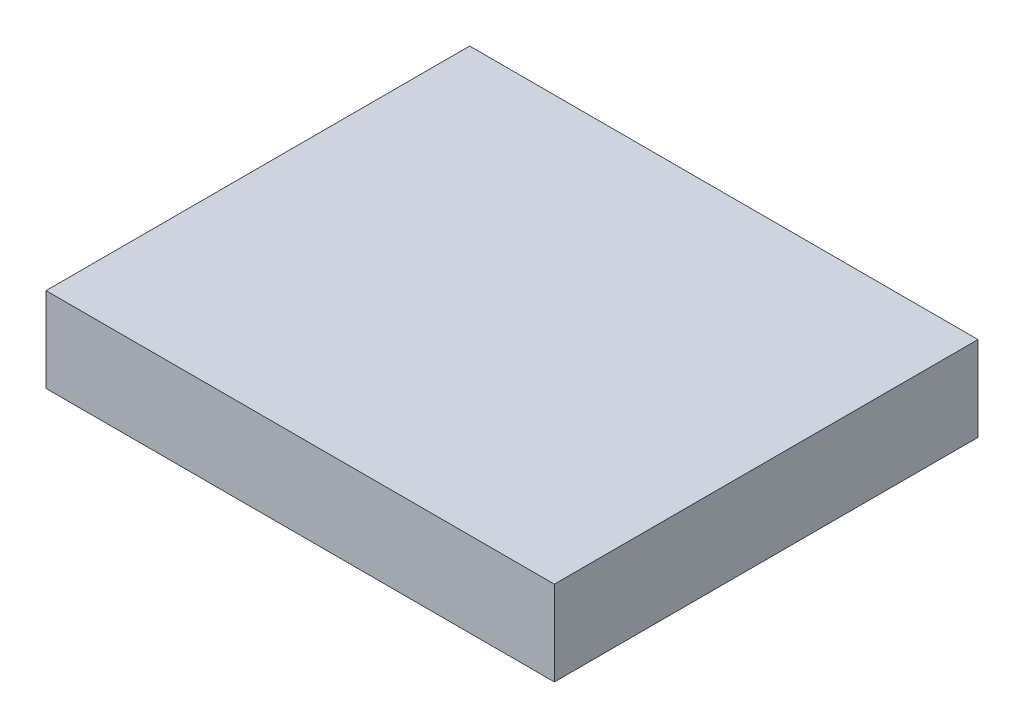
ISO-10303-21;
HEADER;
FILE_DESCRIPTION(('STEP AP214'),'2;1');
FILE_NAME('part.step','',(''),(''),'','','');
FILE_SCHEMA(('AUTOMOTIVE_DESIGN { 1 0 10303 214 1 1 1 1 }'));
ENDSEC;
DATA;
#1=APPLICATION_CONTEXT('core data for automotive mechanical design processes');
#2=APPLICATION_PROTOCOL_DEFINITION('international standard','automotive_design',2000,#1);
#3=PRODUCT_CONTEXT('',#1,'mechanical');
#4=PRODUCT('Part','Part','',(#3));
#5=PRODUCT_RELATED_PRODUCT_CATEGORY('part','',(#4));
#6=PRODUCT_DEFINITION_FORMATION('','',#4);
#7=PRODUCT_DEFINITION_CONTEXT('part definition',#1,'design');
#8=PRODUCT_DEFINITION('design','',#6,#7);
#9=PRODUCT_DEFINITION_SHAPE('','',#8);
#10=(LENGTH_UNIT() NAMED_UNIT(*) SI_UNIT(.MILLI.,.METRE.));
#11=(NAMED_UNIT(*) PLANE_ANGLE_UNIT() SI_UNIT($,.RADIAN.));
#12=(NAMED_UNIT(*) SI_UNIT($,.STERADIAN.) SOLID_ANGLE_UNIT());
#13=UNCERTAINTY_MEASURE_WITH_UNIT(LENGTH_MEASURE(1.E-05),#10,'distance_accuracy_value','');
#14=(GEOMETRIC_REPRESENTATION_CONTEXT(3) GLOBAL_UNCERTAINTY_ASSIGNED_CONTEXT((#13)) GLOBAL_UNIT_ASSIGNED_CONTEXT((#10,
#11,#12)) REPRESENTATION_CONTEXT('',''));
#15=CARTESIAN_POINT('',(0.,0.,0.));
#16=DIRECTION('',(0.,0.,1.));
#17=DIRECTION('',(1.,0.,0.));
#18=AXIS2_PLACEMENT_3D('',#15,#16,#17);
#19=CARTESIAN_POINT('',(38.1,6.35,0.));
#20=DIRECTION('',(1.,0.,0.));
#21=DIRECTION('',(0.,0.,-1.));
#22=AXIS2_PLACEMENT_3D('',#19,#20,#21);
#23=PLANE('',#22);
#24=DIRECTION('',(0.,0.,1.));
#25=VECTOR('',#24,1.);
#26=CARTESIAN_POINT('',(38.1,0.,0.));
#27=LINE('',#26,#25);
#28=CARTESIAN_POINT('',(38.1,0.,-31.75));
#29=VERTEX_POINT('',#28);
#30=CARTESIAN_POINT('',(38.1,0.,0.));
#31=VERTEX_POINT('',#30);
#32=EDGE_CURVE('E98',#29,#31,#27,.T.);
#33=ORIENTED_EDGE('',*,*,#32,.F.);
#34=DIRECTION('',(0.,-1.,0.));
#35=VECTOR('',#34,1.);
#36=CARTESIAN_POINT('',(38.1,6.35,-31.75));
#37=LINE('',#36,#35);
#38=CARTESIAN_POINT('',(38.1,6.35,-31.75));
#39=VERTEX_POINT('',#38);
#40=EDGE_CURVE('E11',#39,#29,#37,.T.);
#41=ORIENTED_EDGE('',*,*,#40,.F.);
#42=DIRECTION('',(0.,0.,1.));
#43=VECTOR('',#42,1.);
#44=CARTESIAN_POINT('',(38.1,6.35,0.));
#45=LINE('',#44,#43);
#46=CARTESIAN_POINT('',(38.1,6.35,0.));
#47=VERTEX_POINT('',#46);
#48=EDGE_CURVE('E91',#39,#47,#45,.T.);
#49=ORIENTED_EDGE('',*,*,#48,.T.);
#50=DIRECTION('',(0.,-1.,0.));
#51=VECTOR('',#50,1.);
#52=CARTESIAN_POINT('',(38.1,6.35,0.));
#53=LINE('',#52,#51);
#54=EDGE_CURVE('E73',#47,#31,#53,.T.);
#55=ORIENTED_EDGE('',*,*,#54,.T.);
#56=EDGE_LOOP('',(#33,#41,#49,#55));
#57=FACE_BOUND('',#56,.T.);
#58=ADVANCED_FACE('F35',(#57),#23,.T.);
#59=CARTESIAN_POINT('',(0.,6.35,-31.75));
#60=DIRECTION('',(0.,0.,-1.));
#61=DIRECTION('',(-1.,0.,0.));
#62=AXIS2_PLACEMENT_3D('',#59,#60,#61);
#63=PLANE('',#62);
#64=DIRECTION('',(1.,0.,0.));
#65=VECTOR('',#64,1.);
#66=CARTESIAN_POINT('',(0.,0.,-31.75));
#67=LINE('',#66,#65);
#68=CARTESIAN_POINT('',(0.,0.,-31.75));
#69=VERTEX_POINT('',#68);
#70=EDGE_CURVE('E84',#69,#29,#67,.T.);
#71=ORIENTED_EDGE('',*,*,#70,.F.);
#72=DIRECTION('',(0.,-1.,0.));
#73=VECTOR('',#72,1.);
#74=CARTESIAN_POINT('',(0.,6.35,-31.75));
#75=LINE('',#74,#73);
#76=CARTESIAN_POINT('',(0.,6.35,-31.75));
#77=VERTEX_POINT('',#76);
#78=EDGE_CURVE('E43',#77,#69,#75,.T.);
#79=ORIENTED_EDGE('',*,*,#78,.F.);
#80=DIRECTION('',(1.,0.,0.));
#81=VECTOR('',#80,1.);
#82=CARTESIAN_POINT('',(0.,6.35,-31.75));
#83=LINE('',#82,#81);
#84=EDGE_CURVE('E82',#77,#39,#83,.T.);
#85=ORIENTED_EDGE('',*,*,#84,.T.);
#86=ORIENTED_EDGE('',*,*,#40,.T.);
#87=EDGE_LOOP('',(#71,#79,#85,#86));
#88=FACE_BOUND('',#87,.T.);
#89=ADVANCED_FACE('F81',(#88),#63,.T.);
#90=CARTESIAN_POINT('',(0.,6.35,0.));
#91=DIRECTION('',(-1.,0.,0.));
#92=DIRECTION('',(0.,0.,1.));
#93=AXIS2_PLACEMENT_3D('',#90,#91,#92);
#94=PLANE('',#93);
#95=DIRECTION('',(0.,0.,-1.));
#96=VECTOR('',#95,1.);
#97=CARTESIAN_POINT('',(0.,0.,0.));
#98=LINE('',#97,#96);
#99=CARTESIAN_POINT('',(0.,0.,0.));
#100=VERTEX_POINT('',#99);
#101=EDGE_CURVE('E102',#100,#69,#98,.T.);
#102=ORIENTED_EDGE('',*,*,#101,.F.);
#103=DIRECTION('',(0.,-1.,0.));
#104=VECTOR('',#103,1.);
#105=CARTESIAN_POINT('',(0.,6.35,0.));
#106=LINE('',#105,#104);
#107=CARTESIAN_POINT('',(0.,6.35,0.));
#108=VERTEX_POINT('',#107);
#109=EDGE_CURVE('E66',#108,#100,#106,.T.);
#110=ORIENTED_EDGE('',*,*,#109,.F.);
#111=DIRECTION('',(0.,0.,-1.));
#112=VECTOR('',#111,1.);
#113=CARTESIAN_POINT('',(0.,6.35,0.));
#114=LINE('',#113,#112);
#115=EDGE_CURVE('E90',#108,#77,#114,.T.);
#116=ORIENTED_EDGE('',*,*,#115,.T.);
#117=ORIENTED_EDGE('',*,*,#78,.T.);
#118=EDGE_LOOP('',(#102,#110,#116,#117));
#119=FACE_BOUND('',#118,.T.);
#120=ADVANCED_FACE('F93',(#119),#94,.T.);
#121=CARTESIAN_POINT('',(0.,6.35,0.));
#122=DIRECTION('',(0.,0.,-1.));
#123=DIRECTION('',(-1.,0.,0.));
#124=AXIS2_PLACEMENT_3D('',#121,#122,#123);
#125=PLANE('',#124);
#126=DIRECTION('',(1.,0.,0.));
#127=VECTOR('',#126,1.);
#128=CARTESIAN_POINT('',(0.,0.,0.));
#129=LINE('',#128,#127);
#130=EDGE_CURVE('E104',#100,#31,#129,.T.);
#131=ORIENTED_EDGE('',*,*,#130,.T.);
#132=ORIENTED_EDGE('',*,*,#54,.F.);
#133=DIRECTION('',(1.,0.,0.));
#134=VECTOR('',#133,1.);
#135=CARTESIAN_POINT('',(0.,6.35,0.));
#136=LINE('',#135,#134);
#137=EDGE_CURVE('E51',#108,#47,#136,.T.);
#138=ORIENTED_EDGE('',*,*,#137,.F.);
#139=ORIENTED_EDGE('',*,*,#109,.T.);
#140=EDGE_LOOP('',(#131,#132,#138,#139));
#141=FACE_BOUND('',#140,.T.);
#142=ADVANCED_FACE('F114',(#141),#125,.F.);
#143=CARTESIAN_POINT('',(0.,6.35,0.));
#144=DIRECTION('',(0.,1.,0.));
#145=DIRECTION('',(0.,0.,1.));
#146=AXIS2_PLACEMENT_3D('',#143,#144,#145);
#147=PLANE('',#146);
#148=ORIENTED_EDGE('',*,*,#48,.F.);
#149=ORIENTED_EDGE('',*,*,#84,.F.);
#150=ORIENTED_EDGE('',*,*,#115,.F.);
#151=ORIENTED_EDGE('',*,*,#137,.T.);
#152=EDGE_LOOP('',(#148,#149,#150,#151));
#153=FACE_BOUND('',#152,.T.);
#154=ADVANCED_FACE('F89',(#153),#147,.T.);
#155=CARTESIAN_POINT('',(0.,0.,0.));
#156=DIRECTION('',(0.,1.,0.));
#157=DIRECTION('',(0.,0.,1.));
#158=AXIS2_PLACEMENT_3D('',#155,#156,#157);
#159=PLANE('',#158);
#160=ORIENTED_EDGE('',*,*,#32,.T.);
#161=ORIENTED_EDGE('',*,*,#130,.F.);
#162=ORIENTED_EDGE('',*,*,#101,.T.);
#163=ORIENTED_EDGE('',*,*,#70,.T.);
#164=EDGE_LOOP('',(#160,#161,#162,#163));
#165=FACE_BOUND('',#164,.T.);
#166=ADVANCED_FACE('F119',(#165),#159,.F.);
#167=CLOSED_SHELL('',(#58,#89,#120,#142,#154,#166));
#168=MANIFOLD_SOLID_BREP('B2',#167);
#169=ADVANCED_BREP_SHAPE_REPRESENTATION('',(#18,#168),#14);
#170=SHAPE_DEFINITION_REPRESENTATION(#9,#169);
ENDSEC;
END-ISO-10303-21;
